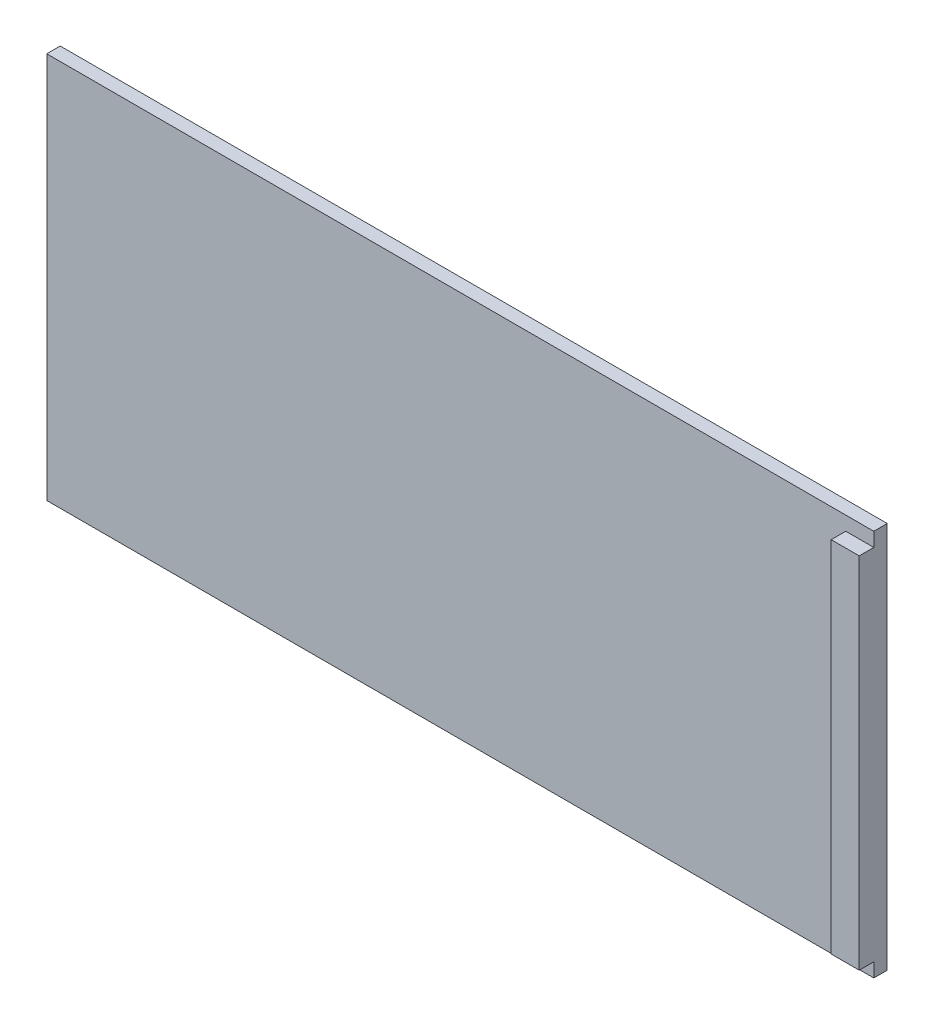
ISO-10303-21;
HEADER;
FILE_DESCRIPTION(('STEP AP214'),'2;1');
FILE_NAME('part.step','',(''),(''),'','','');
FILE_SCHEMA(('AUTOMOTIVE_DESIGN { 1 0 10303 214 1 1 1 1 }'));
ENDSEC;
DATA;
#1=APPLICATION_CONTEXT('core data for automotive mechanical design processes');
#2=APPLICATION_PROTOCOL_DEFINITION('international standard','automotive_design',2000,#1);
#3=PRODUCT_CONTEXT('',#1,'mechanical');
#4=PRODUCT('Part','Part','',(#3));
#5=PRODUCT_RELATED_PRODUCT_CATEGORY('part','',(#4));
#6=PRODUCT_DEFINITION_FORMATION('','',#4);
#7=PRODUCT_DEFINITION_CONTEXT('part definition',#1,'design');
#8=PRODUCT_DEFINITION('design','',#6,#7);
#9=PRODUCT_DEFINITION_SHAPE('','',#8);
#10=(LENGTH_UNIT() NAMED_UNIT(*) SI_UNIT(.MILLI.,.METRE.));
#11=(NAMED_UNIT(*) PLANE_ANGLE_UNIT() SI_UNIT($,.RADIAN.));
#12=(NAMED_UNIT(*) SI_UNIT($,.STERADIAN.) SOLID_ANGLE_UNIT());
#13=UNCERTAINTY_MEASURE_WITH_UNIT(LENGTH_MEASURE(1.E-05),#10,'distance_accuracy_value','');
#14=(GEOMETRIC_REPRESENTATION_CONTEXT(3) GLOBAL_UNCERTAINTY_ASSIGNED_CONTEXT((#13)) GLOBAL_UNIT_ASSIGNED_CONTEXT((#10,
#11,#12)) REPRESENTATION_CONTEXT('',''));
#15=CARTESIAN_POINT('',(0.,0.,0.));
#16=DIRECTION('',(0.,0.,1.));
#17=DIRECTION('',(1.,0.,0.));
#18=AXIS2_PLACEMENT_3D('',#15,#16,#17);
#19=CARTESIAN_POINT('',(0.,0.,1.2192));
#20=DIRECTION('',(0.,0.,-1.));
#21=DIRECTION('',(-1.,0.,0.));
#22=AXIS2_PLACEMENT_3D('',#19,#20,#21);
#23=PLANE('',#22);
#24=DIRECTION('',(1.,0.,0.));
#25=VECTOR('',#24,1.);
#26=CARTESIAN_POINT('',(74.93,1.27,1.2192));
#27=LINE('',#26,#25);
#28=CARTESIAN_POINT('',(72.39,1.27,1.2192));
#29=VERTEX_POINT('',#28);
#30=CARTESIAN_POINT('',(74.93,1.27,1.2192));
#31=VERTEX_POINT('',#30);
#32=EDGE_CURVE('E53',#29,#31,#27,.T.);
#33=ORIENTED_EDGE('',*,*,#32,.F.);
#34=DIRECTION('',(0.,-1.,0.));
#35=VECTOR('',#34,1.);
#36=CARTESIAN_POINT('',(72.39,33.782,1.2192));
#37=LINE('',#36,#35);
#38=CARTESIAN_POINT('',(72.39,33.782,1.2192));
#39=VERTEX_POINT('',#38);
#40=EDGE_CURVE('E249',#39,#29,#37,.T.);
#41=ORIENTED_EDGE('',*,*,#40,.F.);
#42=DIRECTION('',(-1.,0.,0.));
#43=VECTOR('',#42,1.);
#44=CARTESIAN_POINT('',(74.93,33.782,1.2192));
#45=LINE('',#44,#43);
#46=CARTESIAN_POINT('',(74.93,33.782,1.2192));
#47=VERTEX_POINT('',#46);
#48=EDGE_CURVE('E58',#47,#39,#45,.T.);
#49=ORIENTED_EDGE('',*,*,#48,.F.);
#50=DIRECTION('',(0.,1.,0.));
#51=VECTOR('',#50,1.);
#52=CARTESIAN_POINT('',(74.93,0.,1.2192));
#53=LINE('',#52,#51);
#54=CARTESIAN_POINT('',(74.93,35.052,1.2192));
#55=VERTEX_POINT('',#54);
#56=EDGE_CURVE('E121',#47,#55,#53,.T.);
#57=ORIENTED_EDGE('',*,*,#56,.T.);
#58=DIRECTION('',(-1.,0.,0.));
#59=VECTOR('',#58,1.);
#60=CARTESIAN_POINT('',(0.,35.052,1.2192));
#61=LINE('',#60,#59);
#62=CARTESIAN_POINT('',(0.,35.052,1.2192));
#63=VERTEX_POINT('',#62);
#64=EDGE_CURVE('E141',#55,#63,#61,.T.);
#65=ORIENTED_EDGE('',*,*,#64,.T.);
#66=DIRECTION('',(0.,-1.,0.));
#67=VECTOR('',#66,1.);
#68=CARTESIAN_POINT('',(0.,0.,1.2192));
#69=LINE('',#68,#67);
#70=CARTESIAN_POINT('',(0.,0.,1.2192));
#71=VERTEX_POINT('',#70);
#72=EDGE_CURVE('E131',#63,#71,#69,.T.);
#73=ORIENTED_EDGE('',*,*,#72,.T.);
#74=DIRECTION('',(1.,0.,0.));
#75=VECTOR('',#74,1.);
#76=CARTESIAN_POINT('',(0.,0.,1.2192));
#77=LINE('',#76,#75);
#78=CARTESIAN_POINT('',(74.93,0.,1.2192));
#79=VERTEX_POINT('',#78);
#80=EDGE_CURVE('E137',#71,#79,#77,.T.);
#81=ORIENTED_EDGE('',*,*,#80,.T.);
#82=EDGE_CURVE('E143',#79,#31,#53,.T.);
#83=ORIENTED_EDGE('',*,*,#82,.T.);
#84=EDGE_LOOP('',(#33,#41,#49,#57,#65,#73,#81,#83));
#85=FACE_BOUND('',#84,.T.);
#86=ADVANCED_FACE('F39',(#85),#23,.F.);
#87=CARTESIAN_POINT('',(0.,0.,1.2192));
#88=DIRECTION('',(1.,0.,0.));
#89=DIRECTION('',(0.,0.,-1.));
#90=AXIS2_PLACEMENT_3D('',#87,#88,#89);
#91=PLANE('',#90);
#92=DIRECTION('',(0.,-1.,0.));
#93=VECTOR('',#92,1.);
#94=CARTESIAN_POINT('',(0.,0.,0.));
#95=LINE('',#94,#93);
#96=CARTESIAN_POINT('',(0.,35.052,0.));
#97=VERTEX_POINT('',#96);
#98=CARTESIAN_POINT('',(0.,0.,0.));
#99=VERTEX_POINT('',#98);
#100=EDGE_CURVE('E127',#97,#99,#95,.T.);
#101=ORIENTED_EDGE('',*,*,#100,.T.);
#102=DIRECTION('',(0.,0.,-1.));
#103=VECTOR('',#102,1.);
#104=CARTESIAN_POINT('',(0.,0.,1.2192));
#105=LINE('',#104,#103);
#106=EDGE_CURVE('E11',#71,#99,#105,.T.);
#107=ORIENTED_EDGE('',*,*,#106,.F.);
#108=ORIENTED_EDGE('',*,*,#72,.F.);
#109=DIRECTION('',(0.,0.,-1.));
#110=VECTOR('',#109,1.);
#111=CARTESIAN_POINT('',(0.,35.052,1.2192));
#112=LINE('',#111,#110);
#113=EDGE_CURVE('E145',#63,#97,#112,.T.);
#114=ORIENTED_EDGE('',*,*,#113,.T.);
#115=EDGE_LOOP('',(#101,#107,#108,#114));
#116=FACE_BOUND('',#115,.T.);
#117=ADVANCED_FACE('F41',(#116),#91,.F.);
#118=CARTESIAN_POINT('',(0.,0.,1.2192));
#119=DIRECTION('',(0.,1.,0.));
#120=DIRECTION('',(0.,0.,1.));
#121=AXIS2_PLACEMENT_3D('',#118,#119,#120);
#122=PLANE('',#121);
#123=DIRECTION('',(1.,0.,0.));
#124=VECTOR('',#123,1.);
#125=CARTESIAN_POINT('',(0.,0.,0.));
#126=LINE('',#125,#124);
#127=CARTESIAN_POINT('',(74.93,0.,0.));
#128=VERTEX_POINT('',#127);
#129=EDGE_CURVE('E129',#99,#128,#126,.T.);
#130=ORIENTED_EDGE('',*,*,#129,.T.);
#131=DIRECTION('',(0.,0.,-1.));
#132=VECTOR('',#131,1.);
#133=CARTESIAN_POINT('',(74.93,0.,1.2192));
#134=LINE('',#133,#132);
#135=EDGE_CURVE('E50',#79,#128,#134,.T.);
#136=ORIENTED_EDGE('',*,*,#135,.F.);
#137=ORIENTED_EDGE('',*,*,#80,.F.);
#138=ORIENTED_EDGE('',*,*,#106,.T.);
#139=EDGE_LOOP('',(#130,#136,#137,#138));
#140=FACE_BOUND('',#139,.T.);
#141=ADVANCED_FACE('F168',(#140),#122,.F.);
#142=CARTESIAN_POINT('',(74.93,0.,1.2192));
#143=DIRECTION('',(-1.,0.,0.));
#144=DIRECTION('',(0.,0.,1.));
#145=AXIS2_PLACEMENT_3D('',#142,#143,#144);
#146=PLANE('',#145);
#147=DIRECTION('',(0.,1.,0.));
#148=VECTOR('',#147,1.);
#149=CARTESIAN_POINT('',(74.93,0.,0.));
#150=LINE('',#149,#148);
#151=CARTESIAN_POINT('',(74.93,35.052,0.));
#152=VERTEX_POINT('',#151);
#153=EDGE_CURVE('E150',#128,#152,#150,.T.);
#154=ORIENTED_EDGE('',*,*,#153,.T.);
#155=DIRECTION('',(0.,0.,-1.));
#156=VECTOR('',#155,1.);
#157=CARTESIAN_POINT('',(74.93,35.052,1.2192));
#158=LINE('',#157,#156);
#159=EDGE_CURVE('E155',#55,#152,#158,.T.);
#160=ORIENTED_EDGE('',*,*,#159,.F.);
#161=ORIENTED_EDGE('',*,*,#56,.F.);
#162=DIRECTION('',(0.,0.,-1.));
#163=VECTOR('',#162,1.);
#164=CARTESIAN_POINT('',(74.93,33.782,2.54));
#165=LINE('',#164,#163);
#166=CARTESIAN_POINT('',(74.93,33.782,2.54));
#167=VERTEX_POINT('',#166);
#168=EDGE_CURVE('E110',#167,#47,#165,.T.);
#169=ORIENTED_EDGE('',*,*,#168,.F.);
#170=DIRECTION('',(0.,1.,0.));
#171=VECTOR('',#170,1.);
#172=CARTESIAN_POINT('',(74.93,33.782,2.54));
#173=LINE('',#172,#171);
#174=CARTESIAN_POINT('',(74.93,1.27,2.54));
#175=VERTEX_POINT('',#174);
#176=EDGE_CURVE('E114',#175,#167,#173,.T.);
#177=ORIENTED_EDGE('',*,*,#176,.F.);
#178=DIRECTION('',(0.,0.,-1.));
#179=VECTOR('',#178,1.);
#180=CARTESIAN_POINT('',(74.93,1.27,2.54));
#181=LINE('',#180,#179);
#182=EDGE_CURVE('E241',#175,#31,#181,.T.);
#183=ORIENTED_EDGE('',*,*,#182,.T.);
#184=ORIENTED_EDGE('',*,*,#82,.F.);
#185=ORIENTED_EDGE('',*,*,#135,.T.);
#186=EDGE_LOOP('',(#154,#160,#161,#169,#177,#183,#184,#185));
#187=FACE_BOUND('',#186,.T.);
#188=ADVANCED_FACE('F122',(#187),#146,.F.);
#189=CARTESIAN_POINT('',(0.,35.052,1.2192));
#190=DIRECTION('',(0.,-1.,0.));
#191=DIRECTION('',(0.,0.,-1.));
#192=AXIS2_PLACEMENT_3D('',#189,#190,#191);
#193=PLANE('',#192);
#194=DIRECTION('',(-1.,0.,0.));
#195=VECTOR('',#194,1.);
#196=CARTESIAN_POINT('',(0.,35.052,0.));
#197=LINE('',#196,#195);
#198=EDGE_CURVE('E140',#152,#97,#197,.T.);
#199=ORIENTED_EDGE('',*,*,#198,.T.);
#200=ORIENTED_EDGE('',*,*,#113,.F.);
#201=ORIENTED_EDGE('',*,*,#64,.F.);
#202=ORIENTED_EDGE('',*,*,#159,.T.);
#203=EDGE_LOOP('',(#199,#200,#201,#202));
#204=FACE_BOUND('',#203,.T.);
#205=ADVANCED_FACE('F164',(#204),#193,.F.);
#206=CARTESIAN_POINT('',(0.,0.,0.));
#207=DIRECTION('',(0.,0.,-1.));
#208=DIRECTION('',(-1.,0.,0.));
#209=AXIS2_PLACEMENT_3D('',#206,#207,#208);
#210=PLANE('',#209);
#211=ORIENTED_EDGE('',*,*,#100,.F.);
#212=ORIENTED_EDGE('',*,*,#198,.F.);
#213=ORIENTED_EDGE('',*,*,#153,.F.);
#214=ORIENTED_EDGE('',*,*,#129,.F.);
#215=EDGE_LOOP('',(#211,#212,#213,#214));
#216=FACE_BOUND('',#215,.T.);
#217=ADVANCED_FACE('F165',(#216),#210,.T.);
#218=CARTESIAN_POINT('',(74.93,33.782,2.54));
#219=DIRECTION('',(0.,-1.,0.));
#220=DIRECTION('',(0.,0.,-1.));
#221=AXIS2_PLACEMENT_3D('',#218,#219,#220);
#222=PLANE('',#221);
#223=ORIENTED_EDGE('',*,*,#48,.T.);
#224=DIRECTION('',(0.,0.,-1.));
#225=VECTOR('',#224,1.);
#226=CARTESIAN_POINT('',(72.39,33.782,2.54));
#227=LINE('',#226,#225);
#228=CARTESIAN_POINT('',(72.39,33.782,2.54));
#229=VERTEX_POINT('',#228);
#230=EDGE_CURVE('E108',#229,#39,#227,.T.);
#231=ORIENTED_EDGE('',*,*,#230,.F.);
#232=DIRECTION('',(-1.,0.,0.));
#233=VECTOR('',#232,1.);
#234=CARTESIAN_POINT('',(74.93,33.782,2.54));
#235=LINE('',#234,#233);
#236=EDGE_CURVE('E103',#167,#229,#235,.T.);
#237=ORIENTED_EDGE('',*,*,#236,.F.);
#238=ORIENTED_EDGE('',*,*,#168,.T.);
#239=EDGE_LOOP('',(#223,#231,#237,#238));
#240=FACE_BOUND('',#239,.T.);
#241=ADVANCED_FACE('F104',(#240),#222,.F.);
#242=CARTESIAN_POINT('',(72.39,33.782,2.54));
#243=DIRECTION('',(1.,0.,0.));
#244=DIRECTION('',(0.,0.,-1.));
#245=AXIS2_PLACEMENT_3D('',#242,#243,#244);
#246=PLANE('',#245);
#247=ORIENTED_EDGE('',*,*,#40,.T.);
#248=DIRECTION('',(0.,0.,-1.));
#249=VECTOR('',#248,1.);
#250=CARTESIAN_POINT('',(72.39,1.27,2.54));
#251=LINE('',#250,#249);
#252=CARTESIAN_POINT('',(72.39,1.27,2.54));
#253=VERTEX_POINT('',#252);
#254=EDGE_CURVE('E133',#253,#29,#251,.T.);
#255=ORIENTED_EDGE('',*,*,#254,.F.);
#256=DIRECTION('',(0.,-1.,0.));
#257=VECTOR('',#256,1.);
#258=CARTESIAN_POINT('',(72.39,33.782,2.54));
#259=LINE('',#258,#257);
#260=EDGE_CURVE('E115',#229,#253,#259,.T.);
#261=ORIENTED_EDGE('',*,*,#260,.F.);
#262=ORIENTED_EDGE('',*,*,#230,.T.);
#263=EDGE_LOOP('',(#247,#255,#261,#262));
#264=FACE_BOUND('',#263,.T.);
#265=ADVANCED_FACE('F216',(#264),#246,.F.);
#266=CARTESIAN_POINT('',(74.93,1.27,2.54));
#267=DIRECTION('',(0.,1.,0.));
#268=DIRECTION('',(-1.,0.,0.));
#269=AXIS2_PLACEMENT_3D('',#266,#267,#268);
#270=PLANE('',#269);
#271=ORIENTED_EDGE('',*,*,#32,.T.);
#272=ORIENTED_EDGE('',*,*,#182,.F.);
#273=DIRECTION('',(1.,0.,0.));
#274=VECTOR('',#273,1.);
#275=CARTESIAN_POINT('',(74.93,1.27,2.54));
#276=LINE('',#275,#274);
#277=EDGE_CURVE('E117',#253,#175,#276,.T.);
#278=ORIENTED_EDGE('',*,*,#277,.F.);
#279=ORIENTED_EDGE('',*,*,#254,.T.);
#280=EDGE_LOOP('',(#271,#272,#278,#279));
#281=FACE_BOUND('',#280,.T.);
#282=ADVANCED_FACE('F221',(#281),#270,.F.);
#283=CARTESIAN_POINT('',(0.,0.,2.54));
#284=DIRECTION('',(0.,0.,-1.));
#285=DIRECTION('',(-1.,0.,0.));
#286=AXIS2_PLACEMENT_3D('',#283,#284,#285);
#287=PLANE('',#286);
#288=ORIENTED_EDGE('',*,*,#176,.T.);
#289=ORIENTED_EDGE('',*,*,#236,.T.);
#290=ORIENTED_EDGE('',*,*,#260,.T.);
#291=ORIENTED_EDGE('',*,*,#277,.T.);
#292=EDGE_LOOP('',(#288,#289,#290,#291));
#293=FACE_BOUND('',#292,.T.);
#294=ADVANCED_FACE('F118',(#293),#287,.F.);
#295=CLOSED_SHELL('',(#86,#117,#141,#188,#205,#217,#241,#265,#282,#294));
#296=MANIFOLD_SOLID_BREP('B2',#295);
#297=ADVANCED_BREP_SHAPE_REPRESENTATION('',(#18,#296),#14);
#298=SHAPE_DEFINITION_REPRESENTATION(#9,#297);
ENDSEC;
END-ISO-10303-21;
